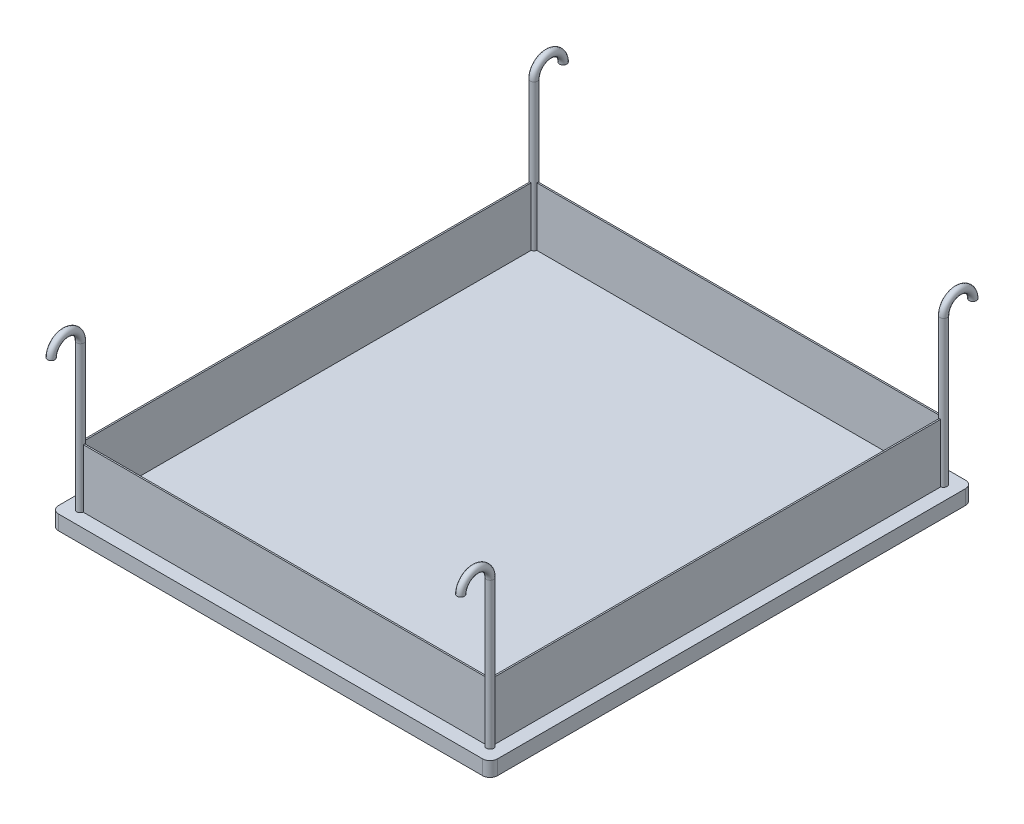
ISO-10303-21;
HEADER;
FILE_DESCRIPTION(('STEP AP214'),'2;1');
FILE_NAME('part.step','',(''),(''),'','','');
FILE_SCHEMA(('AUTOMOTIVE_DESIGN { 1 0 10303 214 1 1 1 1 }'));
ENDSEC;
DATA;
#1=APPLICATION_CONTEXT('core data for automotive mechanical design processes');
#2=APPLICATION_PROTOCOL_DEFINITION('international standard','automotive_design',2000,#1);
#3=PRODUCT_CONTEXT('',#1,'mechanical');
#4=PRODUCT('Part','Part','',(#3));
#5=PRODUCT_RELATED_PRODUCT_CATEGORY('part','',(#4));
#6=PRODUCT_DEFINITION_FORMATION('','',#4);
#7=PRODUCT_DEFINITION_CONTEXT('part definition',#1,'design');
#8=PRODUCT_DEFINITION('design','',#6,#7);
#9=PRODUCT_DEFINITION_SHAPE('','',#8);
#10=(LENGTH_UNIT() NAMED_UNIT(*) SI_UNIT(.MILLI.,.METRE.));
#11=(NAMED_UNIT(*) PLANE_ANGLE_UNIT() SI_UNIT($,.RADIAN.));
#12=(NAMED_UNIT(*) SI_UNIT($,.STERADIAN.) SOLID_ANGLE_UNIT());
#13=UNCERTAINTY_MEASURE_WITH_UNIT(LENGTH_MEASURE(1.E-05),#10,'distance_accuracy_value','');
#14=(GEOMETRIC_REPRESENTATION_CONTEXT(3) GLOBAL_UNCERTAINTY_ASSIGNED_CONTEXT((#13)) GLOBAL_UNIT_ASSIGNED_CONTEXT((#10,
#11,#12)) REPRESENTATION_CONTEXT('',''));
#15=CARTESIAN_POINT('',(0.,0.,0.));
#16=DIRECTION('',(0.,0.,1.));
#17=DIRECTION('',(1.,0.,0.));
#18=AXIS2_PLACEMENT_3D('',#15,#16,#17);
#19=CARTESIAN_POINT('',(0.,10.,0.));
#20=DIRECTION('',(0.,1.,0.));
#21=DIRECTION('',(0.,0.,1.));
#22=AXIS2_PLACEMENT_3D('',#19,#20,#21);
#23=PLANE('',#22);
#24=CARTESIAN_POINT('',(-140.,10.,-155.));
#25=DIRECTION('',(0.,1.,0.));
#26=DIRECTION('',(0.,0.,1.));
#27=AXIS2_PLACEMENT_3D('',#24,#25,#26);
#28=CIRCLE('',#27,2.5);
#29=CARTESIAN_POINT('',(-139.5,10.,-152.550510257217));
#30=VERTEX_POINT('',#29);
#31=CARTESIAN_POINT('',(-137.550510257217,10.,-154.5));
#32=VERTEX_POINT('',#31);
#33=EDGE_CURVE('E234',#30,#32,#28,.T.);
#34=ORIENTED_EDGE('',*,*,#33,.F.);
#35=DIRECTION('',(0.,0.,-1.));
#36=VECTOR('',#35,1.);
#37=CARTESIAN_POINT('',(-139.5,10.,0.));
#38=LINE('',#37,#36);
#39=CARTESIAN_POINT('',(-139.5,10.,152.550510257217));
#40=VERTEX_POINT('',#39);
#41=EDGE_CURVE('E273',#30,#40,#38,.F.);
#42=ORIENTED_EDGE('',*,*,#41,.T.);
#43=CARTESIAN_POINT('',(-140.,10.,155.));
#44=DIRECTION('',(0.,1.,0.));
#45=DIRECTION('',(0.,0.,1.));
#46=AXIS2_PLACEMENT_3D('',#43,#44,#45);
#47=CIRCLE('',#46,2.5);
#48=CARTESIAN_POINT('',(-137.550510257217,10.,154.5));
#49=VERTEX_POINT('',#48);
#50=EDGE_CURVE('E322',#49,#40,#47,.T.);
#51=ORIENTED_EDGE('',*,*,#50,.F.);
#52=DIRECTION('',(1.,0.,0.));
#53=VECTOR('',#52,1.);
#54=CARTESIAN_POINT('',(-140.,10.,154.5));
#55=LINE('',#54,#53);
#56=CARTESIAN_POINT('',(137.550510257217,10.,154.5));
#57=VERTEX_POINT('',#56);
#58=EDGE_CURVE('E370',#49,#57,#55,.T.);
#59=ORIENTED_EDGE('',*,*,#58,.T.);
#60=CARTESIAN_POINT('',(140.,10.,155.));
#61=DIRECTION('',(0.,1.,0.));
#62=DIRECTION('',(0.,0.,1.));
#63=AXIS2_PLACEMENT_3D('',#60,#61,#62);
#64=CIRCLE('',#63,2.5);
#65=CARTESIAN_POINT('',(139.5,10.,152.550510257217));
#66=VERTEX_POINT('',#65);
#67=EDGE_CURVE('E319',#66,#57,#64,.T.);
#68=ORIENTED_EDGE('',*,*,#67,.F.);
#69=DIRECTION('',(0.,0.,-1.));
#70=VECTOR('',#69,1.);
#71=CARTESIAN_POINT('',(139.5,10.,155.));
#72=LINE('',#71,#70);
#73=CARTESIAN_POINT('',(139.5,10.,-152.550510257217));
#74=VERTEX_POINT('',#73);
#75=EDGE_CURVE('E207',#66,#74,#72,.T.);
#76=ORIENTED_EDGE('',*,*,#75,.T.);
#77=CARTESIAN_POINT('',(140.,10.,-155.));
#78=DIRECTION('',(0.,1.,0.));
#79=DIRECTION('',(0.,0.,1.));
#80=AXIS2_PLACEMENT_3D('',#77,#78,#79);
#81=CIRCLE('',#80,2.5);
#82=CARTESIAN_POINT('',(137.550510257217,10.,-154.5));
#83=VERTEX_POINT('',#82);
#84=EDGE_CURVE('E228',#83,#74,#81,.T.);
#85=ORIENTED_EDGE('',*,*,#84,.F.);
#86=DIRECTION('',(1.,0.,0.));
#87=VECTOR('',#86,1.);
#88=CARTESIAN_POINT('',(-140.,10.,-154.5));
#89=LINE('',#88,#87);
#90=EDGE_CURVE('E276',#32,#83,#89,.T.);
#91=ORIENTED_EDGE('',*,*,#90,.F.);
#92=EDGE_LOOP('',(#34,#42,#51,#59,#68,#76,#85,#91));
#93=FACE_BOUND('',#92,.T.);
#94=ADVANCED_FACE('F33',(#93),#23,.T.);
#95=CARTESIAN_POINT('',(140.,10.,155.));
#96=DIRECTION('',(0.,1.,0.));
#97=DIRECTION('',(0.,0.,1.));
#98=AXIS2_PLACEMENT_3D('',#95,#96,#97);
#99=CYLINDRICAL_SURFACE('',#98,2.5);
#100=DIRECTION('',(0.,1.,0.));
#101=VECTOR('',#100,1.);
#102=CARTESIAN_POINT('',(137.550510257217,10.,154.5));
#103=LINE('',#102,#101);
#104=CARTESIAN_POINT('',(137.550510257217,50.,154.5));
#105=VERTEX_POINT('',#104);
#106=EDGE_CURVE('E284',#105,#57,#103,.F.);
#107=ORIENTED_EDGE('',*,*,#106,.F.);
#108=CARTESIAN_POINT('',(140.,50.,155.));
#109=DIRECTION('',(0.,-1.,0.));
#110=DIRECTION('',(0.,0.,-1.));
#111=AXIS2_PLACEMENT_3D('',#108,#109,#110);
#112=CIRCLE('',#111,2.5);
#113=CARTESIAN_POINT('',(137.550510257217,50.,155.5));
#114=VERTEX_POINT('',#113);
#115=EDGE_CURVE('E291',#105,#114,#112,.F.);
#116=ORIENTED_EDGE('',*,*,#115,.T.);
#117=DIRECTION('',(0.,1.,0.));
#118=VECTOR('',#117,1.);
#119=CARTESIAN_POINT('',(137.550510257217,10.,155.5));
#120=LINE('',#119,#118);
#121=CARTESIAN_POINT('',(137.550510257217,10.,155.5));
#122=VERTEX_POINT('',#121);
#123=EDGE_CURVE('E288',#114,#122,#120,.F.);
#124=ORIENTED_EDGE('',*,*,#123,.T.);
#125=CARTESIAN_POINT('',(140.5,10.,152.550510257217));
#126=VERTEX_POINT('',#125);
#127=EDGE_CURVE('E320',#122,#126,#64,.T.);
#128=ORIENTED_EDGE('',*,*,#127,.T.);
#129=DIRECTION('',(0.,1.,0.));
#130=VECTOR('',#129,1.);
#131=CARTESIAN_POINT('',(140.5,10.,152.550510257217));
#132=LINE('',#131,#130);
#133=CARTESIAN_POINT('',(140.5,50.,152.550510257217));
#134=VERTEX_POINT('',#133);
#135=EDGE_CURVE('E202',#126,#134,#132,.T.);
#136=ORIENTED_EDGE('',*,*,#135,.T.);
#137=CARTESIAN_POINT('',(139.5,50.,152.550510257217));
#138=VERTEX_POINT('',#137);
#139=EDGE_CURVE('E296',#134,#138,#112,.F.);
#140=ORIENTED_EDGE('',*,*,#139,.T.);
#141=DIRECTION('',(0.,1.,0.));
#142=VECTOR('',#141,1.);
#143=CARTESIAN_POINT('',(139.5,10.,152.550510257217));
#144=LINE('',#143,#142);
#145=EDGE_CURVE('E293',#66,#138,#144,.T.);
#146=ORIENTED_EDGE('',*,*,#145,.F.);
#147=ORIENTED_EDGE('',*,*,#67,.T.);
#148=EDGE_LOOP('',(#107,#116,#124,#128,#136,#140,#146,#147));
#149=FACE_BOUND('',#148,.T.);
#150=CARTESIAN_POINT('',(140.,110.,155.));
#151=DIRECTION('',(0.,1.,0.));
#152=DIRECTION('',(0.,0.,1.));
#153=AXIS2_PLACEMENT_3D('',#150,#151,#152);
#154=CIRCLE('',#153,2.5);
#155=CARTESIAN_POINT('',(140.,110.,152.5));
#156=VERTEX_POINT('',#155);
#157=EDGE_CURVE('E351',#156,#156,#154,.T.);
#158=ORIENTED_EDGE('',*,*,#157,.F.);
#159=EDGE_LOOP('',(#158));
#160=FACE_BOUND('',#159,.T.);
#161=ADVANCED_FACE('F430',(#149,#160),#99,.T.);
#162=CARTESIAN_POINT('',(-150.,10.,0.));
#163=DIRECTION('',(1.,0.,0.));
#164=DIRECTION('',(0.,0.,-1.));
#165=AXIS2_PLACEMENT_3D('',#162,#163,#164);
#166=PLANE('',#165);
#167=DIRECTION('',(0.,0.,1.));
#168=VECTOR('',#167,1.);
#169=CARTESIAN_POINT('',(-150.,10.,0.));
#170=LINE('',#169,#168);
#171=CARTESIAN_POINT('',(-150.,10.,-160.));
#172=VERTEX_POINT('',#171);
#173=CARTESIAN_POINT('',(-150.,10.,160.));
#174=VERTEX_POINT('',#173);
#175=EDGE_CURVE('E330',#172,#174,#170,.T.);
#176=ORIENTED_EDGE('',*,*,#175,.F.);
#177=DIRECTION('',(0.,-1.,0.));
#178=VECTOR('',#177,1.);
#179=CARTESIAN_POINT('',(-150.,0.,-160.));
#180=LINE('',#179,#178);
#181=CARTESIAN_POINT('',(-150.,0.,-160.));
#182=VERTEX_POINT('',#181);
#183=EDGE_CURVE('E227',#172,#182,#180,.T.);
#184=ORIENTED_EDGE('',*,*,#183,.T.);
#185=DIRECTION('',(0.,0.,1.));
#186=VECTOR('',#185,1.);
#187=CARTESIAN_POINT('',(-150.,0.,0.));
#188=LINE('',#187,#186);
#189=CARTESIAN_POINT('',(-150.,0.,160.));
#190=VERTEX_POINT('',#189);
#191=EDGE_CURVE('E334',#182,#190,#188,.T.);
#192=ORIENTED_EDGE('',*,*,#191,.T.);
#193=DIRECTION('',(0.,-1.,0.));
#194=VECTOR('',#193,1.);
#195=CARTESIAN_POINT('',(-150.,10.,160.));
#196=LINE('',#195,#194);
#197=EDGE_CURVE('E306',#190,#174,#196,.F.);
#198=ORIENTED_EDGE('',*,*,#197,.T.);
#199=EDGE_LOOP('',(#176,#184,#192,#198));
#200=FACE_BOUND('',#199,.T.);
#201=ADVANCED_FACE('F435',(#200),#166,.F.);
#202=CARTESIAN_POINT('',(-150.,10.,165.));
#203=DIRECTION('',(0.,0.,-1.));
#204=DIRECTION('',(-1.,0.,0.));
#205=AXIS2_PLACEMENT_3D('',#202,#203,#204);
#206=PLANE('',#205);
#207=DIRECTION('',(1.,0.,0.));
#208=VECTOR('',#207,1.);
#209=CARTESIAN_POINT('',(-150.,10.,165.));
#210=LINE('',#209,#208);
#211=CARTESIAN_POINT('',(-145.,10.,165.));
#212=VERTEX_POINT('',#211);
#213=CARTESIAN_POINT('',(145.,10.,165.));
#214=VERTEX_POINT('',#213);
#215=EDGE_CURVE('E339',#212,#214,#210,.T.);
#216=ORIENTED_EDGE('',*,*,#215,.F.);
#217=DIRECTION('',(0.,-1.,0.));
#218=VECTOR('',#217,1.);
#219=CARTESIAN_POINT('',(-145.,10.,165.));
#220=LINE('',#219,#218);
#221=CARTESIAN_POINT('',(-145.,0.,165.));
#222=VERTEX_POINT('',#221);
#223=EDGE_CURVE('E314',#212,#222,#220,.T.);
#224=ORIENTED_EDGE('',*,*,#223,.T.);
#225=DIRECTION('',(1.,0.,0.));
#226=VECTOR('',#225,1.);
#227=CARTESIAN_POINT('',(-150.,0.,165.));
#228=LINE('',#227,#226);
#229=CARTESIAN_POINT('',(145.,0.,165.));
#230=VERTEX_POINT('',#229);
#231=EDGE_CURVE('E331',#222,#230,#228,.T.);
#232=ORIENTED_EDGE('',*,*,#231,.T.);
#233=DIRECTION('',(0.,-1.,0.));
#234=VECTOR('',#233,1.);
#235=CARTESIAN_POINT('',(145.,10.,165.));
#236=LINE('',#235,#234);
#237=EDGE_CURVE('E317',#230,#214,#236,.F.);
#238=ORIENTED_EDGE('',*,*,#237,.T.);
#239=EDGE_LOOP('',(#216,#224,#232,#238));
#240=FACE_BOUND('',#239,.T.);
#241=ADVANCED_FACE('F450',(#240),#206,.F.);
#242=CARTESIAN_POINT('',(150.,10.,0.));
#243=DIRECTION('',(-1.,0.,0.));
#244=DIRECTION('',(0.,0.,1.));
#245=AXIS2_PLACEMENT_3D('',#242,#243,#244);
#246=PLANE('',#245);
#247=DIRECTION('',(0.,0.,-1.));
#248=VECTOR('',#247,1.);
#249=CARTESIAN_POINT('',(150.,0.,0.));
#250=LINE('',#249,#248);
#251=CARTESIAN_POINT('',(150.,0.,160.));
#252=VERTEX_POINT('',#251);
#253=CARTESIAN_POINT('',(150.,0.,-160.));
#254=VERTEX_POINT('',#253);
#255=EDGE_CURVE('E327',#252,#254,#250,.T.);
#256=ORIENTED_EDGE('',*,*,#255,.T.);
#257=DIRECTION('',(0.,-1.,0.));
#258=VECTOR('',#257,1.);
#259=CARTESIAN_POINT('',(150.,10.,-160.));
#260=LINE('',#259,#258);
#261=CARTESIAN_POINT('',(150.,10.,-160.));
#262=VERTEX_POINT('',#261);
#263=EDGE_CURVE('E250',#254,#262,#260,.F.);
#264=ORIENTED_EDGE('',*,*,#263,.T.);
#265=DIRECTION('',(0.,0.,-1.));
#266=VECTOR('',#265,1.);
#267=CARTESIAN_POINT('',(150.,10.,0.));
#268=LINE('',#267,#266);
#269=CARTESIAN_POINT('',(150.,10.,160.));
#270=VERTEX_POINT('',#269);
#271=EDGE_CURVE('E326',#270,#262,#268,.T.);
#272=ORIENTED_EDGE('',*,*,#271,.F.);
#273=DIRECTION('',(0.,-1.,0.));
#274=VECTOR('',#273,1.);
#275=CARTESIAN_POINT('',(150.,10.,160.));
#276=LINE('',#275,#274);
#277=EDGE_CURVE('E299',#270,#252,#276,.T.);
#278=ORIENTED_EDGE('',*,*,#277,.T.);
#279=EDGE_LOOP('',(#256,#264,#272,#278));
#280=FACE_BOUND('',#279,.T.);
#281=ADVANCED_FACE('F442',(#280),#246,.F.);
#282=CARTESIAN_POINT('',(140.5,10.,-152.550510257217));
#283=VERTEX_POINT('',#282);
#284=CARTESIAN_POINT('',(137.550510257217,10.,-155.5));
#285=VERTEX_POINT('',#284);
#286=EDGE_CURVE('E215',#283,#285,#81,.T.);
#287=ORIENTED_EDGE('',*,*,#286,.F.);
#288=DIRECTION('',(0.,0.,-1.));
#289=VECTOR('',#288,1.);
#290=CARTESIAN_POINT('',(140.5,10.,155.));
#291=LINE('',#290,#289);
#292=EDGE_CURVE('E195',#126,#283,#291,.T.);
#293=ORIENTED_EDGE('',*,*,#292,.F.);
#294=ORIENTED_EDGE('',*,*,#127,.F.);
#295=DIRECTION('',(1.,0.,0.));
#296=VECTOR('',#295,1.);
#297=CARTESIAN_POINT('',(-140.,10.,155.5));
#298=LINE('',#297,#296);
#299=CARTESIAN_POINT('',(-137.550510257217,10.,155.5));
#300=VERTEX_POINT('',#299);
#301=EDGE_CURVE('E364',#300,#122,#298,.T.);
#302=ORIENTED_EDGE('',*,*,#301,.F.);
#303=CARTESIAN_POINT('',(-140.5,10.,152.550510257217));
#304=VERTEX_POINT('',#303);
#305=EDGE_CURVE('E323',#304,#300,#47,.T.);
#306=ORIENTED_EDGE('',*,*,#305,.F.);
#307=DIRECTION('',(0.,0.,-1.));
#308=VECTOR('',#307,1.);
#309=CARTESIAN_POINT('',(-140.5,10.,0.));
#310=LINE('',#309,#308);
#311=CARTESIAN_POINT('',(-140.5,10.,-152.550510257217));
#312=VERTEX_POINT('',#311);
#313=EDGE_CURVE('E367',#312,#304,#310,.F.);
#314=ORIENTED_EDGE('',*,*,#313,.F.);
#315=CARTESIAN_POINT('',(-137.550510257217,10.,-155.5));
#316=VERTEX_POINT('',#315);
#317=EDGE_CURVE('E277',#316,#312,#28,.T.);
#318=ORIENTED_EDGE('',*,*,#317,.F.);
#319=DIRECTION('',(1.,0.,0.));
#320=VECTOR('',#319,1.);
#321=CARTESIAN_POINT('',(-140.,10.,-155.5));
#322=LINE('',#321,#320);
#323=EDGE_CURVE('E226',#316,#285,#322,.T.);
#324=ORIENTED_EDGE('',*,*,#323,.T.);
#325=EDGE_LOOP('',(#287,#293,#294,#302,#306,#314,#318,#324));
#326=FACE_BOUND('',#325,.T.);
#327=DIRECTION('',(1.,0.,0.));
#328=VECTOR('',#327,1.);
#329=CARTESIAN_POINT('',(-150.,10.,-165.));
#330=LINE('',#329,#328);
#331=CARTESIAN_POINT('',(-145.,10.,-165.));
#332=VERTEX_POINT('',#331);
#333=CARTESIAN_POINT('',(145.,10.,-165.));
#334=VERTEX_POINT('',#333);
#335=EDGE_CURVE('E208',#332,#334,#330,.T.);
#336=ORIENTED_EDGE('',*,*,#335,.F.);
#337=CARTESIAN_POINT('',(-145.,10.,-160.));
#338=DIRECTION('',(0.,1.,0.));
#339=DIRECTION('',(0.,0.,1.));
#340=AXIS2_PLACEMENT_3D('',#337,#338,#339);
#341=CIRCLE('',#340,5.);
#342=EDGE_CURVE('E248',#332,#172,#341,.T.);
#343=ORIENTED_EDGE('',*,*,#342,.T.);
#344=ORIENTED_EDGE('',*,*,#175,.T.);
#345=CARTESIAN_POINT('',(-145.,10.,160.));
#346=DIRECTION('',(0.,1.,0.));
#347=DIRECTION('',(0.,0.,1.));
#348=AXIS2_PLACEMENT_3D('',#345,#346,#347);
#349=CIRCLE('',#348,5.);
#350=EDGE_CURVE('E302',#174,#212,#349,.T.);
#351=ORIENTED_EDGE('',*,*,#350,.T.);
#352=ORIENTED_EDGE('',*,*,#215,.T.);
#353=CARTESIAN_POINT('',(145.,10.,160.));
#354=DIRECTION('',(0.,1.,0.));
#355=DIRECTION('',(0.,0.,1.));
#356=AXIS2_PLACEMENT_3D('',#353,#354,#355);
#357=CIRCLE('',#356,5.);
#358=EDGE_CURVE('E304',#214,#270,#357,.T.);
#359=ORIENTED_EDGE('',*,*,#358,.T.);
#360=ORIENTED_EDGE('',*,*,#271,.T.);
#361=CARTESIAN_POINT('',(145.,10.,-160.));
#362=DIRECTION('',(0.,1.,0.));
#363=DIRECTION('',(0.,0.,1.));
#364=AXIS2_PLACEMENT_3D('',#361,#362,#363);
#365=CIRCLE('',#364,5.);
#366=EDGE_CURVE('E246',#262,#334,#365,.T.);
#367=ORIENTED_EDGE('',*,*,#366,.T.);
#368=EDGE_LOOP('',(#336,#343,#344,#351,#352,#359,#360,#367));
#369=FACE_BOUND('',#368,.T.);
#370=ADVANCED_FACE('F223',(#326,#369),#23,.T.);
#371=CARTESIAN_POINT('',(0.,0.,0.));
#372=DIRECTION('',(0.,1.,0.));
#373=DIRECTION('',(0.,0.,1.));
#374=AXIS2_PLACEMENT_3D('',#371,#372,#373);
#375=PLANE('',#374);
#376=ORIENTED_EDGE('',*,*,#191,.F.);
#377=CARTESIAN_POINT('',(-145.,0.,-160.));
#378=DIRECTION('',(0.,1.,0.));
#379=DIRECTION('',(0.,0.,1.));
#380=AXIS2_PLACEMENT_3D('',#377,#378,#379);
#381=CIRCLE('',#380,5.);
#382=CARTESIAN_POINT('',(-145.,0.,-165.));
#383=VERTEX_POINT('',#382);
#384=EDGE_CURVE('E239',#182,#383,#381,.F.);
#385=ORIENTED_EDGE('',*,*,#384,.T.);
#386=DIRECTION('',(1.,0.,0.));
#387=VECTOR('',#386,1.);
#388=CARTESIAN_POINT('',(-150.,0.,-165.));
#389=LINE('',#388,#387);
#390=CARTESIAN_POINT('',(145.,0.,-165.));
#391=VERTEX_POINT('',#390);
#392=EDGE_CURVE('E384',#383,#391,#389,.T.);
#393=ORIENTED_EDGE('',*,*,#392,.T.);
#394=CARTESIAN_POINT('',(145.,0.,-160.));
#395=DIRECTION('',(0.,1.,0.));
#396=DIRECTION('',(0.,0.,1.));
#397=AXIS2_PLACEMENT_3D('',#394,#395,#396);
#398=CIRCLE('',#397,5.);
#399=EDGE_CURVE('E231',#391,#254,#398,.F.);
#400=ORIENTED_EDGE('',*,*,#399,.T.);
#401=ORIENTED_EDGE('',*,*,#255,.F.);
#402=CARTESIAN_POINT('',(145.,0.,160.));
#403=DIRECTION('',(0.,1.,0.));
#404=DIRECTION('',(0.,0.,1.));
#405=AXIS2_PLACEMENT_3D('',#402,#403,#404);
#406=CIRCLE('',#405,5.);
#407=EDGE_CURVE('E312',#252,#230,#406,.F.);
#408=ORIENTED_EDGE('',*,*,#407,.T.);
#409=ORIENTED_EDGE('',*,*,#231,.F.);
#410=CARTESIAN_POINT('',(-145.,0.,160.));
#411=DIRECTION('',(0.,1.,0.));
#412=DIRECTION('',(0.,0.,1.));
#413=AXIS2_PLACEMENT_3D('',#410,#411,#412);
#414=CIRCLE('',#413,5.);
#415=EDGE_CURVE('E309',#222,#190,#414,.F.);
#416=ORIENTED_EDGE('',*,*,#415,.T.);
#417=EDGE_LOOP('',(#376,#385,#393,#400,#401,#408,#409,#416));
#418=FACE_BOUND('',#417,.T.);
#419=ADVANCED_FACE('F441',(#418),#375,.F.);
#420=CARTESIAN_POINT('',(-140.,110.,175.));
#421=DIRECTION('',(0.,-1.,0.));
#422=DIRECTION('',(0.,0.,-1.));
#423=AXIS2_PLACEMENT_3D('',#420,#421,#422);
#424=PLANE('',#423);
#425=CARTESIAN_POINT('',(-140.,110.,175.));
#426=DIRECTION('',(0.,-1.,0.));
#427=DIRECTION('',(0.,0.,-1.));
#428=AXIS2_PLACEMENT_3D('',#425,#426,#427);
#429=CIRCLE('',#428,2.5);
#430=CARTESIAN_POINT('',(-140.,110.,177.5));
#431=VERTEX_POINT('',#430);
#432=EDGE_CURVE('E336',#431,#431,#429,.T.);
#433=ORIENTED_EDGE('',*,*,#432,.T.);
#434=EDGE_LOOP('',(#433));
#435=FACE_BOUND('',#434,.T.);
#436=ADVANCED_FACE('F447',(#435),#424,.T.);
#437=CARTESIAN_POINT('',(-140.,10.,155.));
#438=DIRECTION('',(0.,1.,0.));
#439=DIRECTION('',(0.,0.,1.));
#440=AXIS2_PLACEMENT_3D('',#437,#438,#439);
#441=CYLINDRICAL_SURFACE('',#440,2.5);
#442=DIRECTION('',(0.,1.,0.));
#443=VECTOR('',#442,1.);
#444=CARTESIAN_POINT('',(-137.550510257217,10.,154.5));
#445=LINE('',#444,#443);
#446=CARTESIAN_POINT('',(-137.550510257217,50.,154.5));
#447=VERTEX_POINT('',#446);
#448=EDGE_CURVE('E354',#49,#447,#445,.T.);
#449=ORIENTED_EDGE('',*,*,#448,.F.);
#450=ORIENTED_EDGE('',*,*,#50,.T.);
#451=DIRECTION('',(0.,1.,0.));
#452=VECTOR('',#451,1.);
#453=CARTESIAN_POINT('',(-139.5,10.,152.550510257217));
#454=LINE('',#453,#452);
#455=CARTESIAN_POINT('',(-139.5,50.,152.550510257217));
#456=VERTEX_POINT('',#455);
#457=EDGE_CURVE('E279',#456,#40,#454,.F.);
#458=ORIENTED_EDGE('',*,*,#457,.F.);
#459=CARTESIAN_POINT('',(-140.,50.,155.));
#460=DIRECTION('',(0.,-1.,0.));
#461=DIRECTION('',(0.,0.,-1.));
#462=AXIS2_PLACEMENT_3D('',#459,#460,#461);
#463=CIRCLE('',#462,2.5);
#464=CARTESIAN_POINT('',(-140.5,50.,152.550510257217));
#465=VERTEX_POINT('',#464);
#466=EDGE_CURVE('E360',#456,#465,#463,.F.);
#467=ORIENTED_EDGE('',*,*,#466,.T.);
#468=DIRECTION('',(0.,1.,0.));
#469=VECTOR('',#468,1.);
#470=CARTESIAN_POINT('',(-140.5,10.,152.550510257217));
#471=LINE('',#470,#469);
#472=EDGE_CURVE('E281',#465,#304,#471,.F.);
#473=ORIENTED_EDGE('',*,*,#472,.T.);
#474=ORIENTED_EDGE('',*,*,#305,.T.);
#475=DIRECTION('',(0.,1.,0.));
#476=VECTOR('',#475,1.);
#477=CARTESIAN_POINT('',(-137.550510257217,10.,155.5));
#478=LINE('',#477,#476);
#479=CARTESIAN_POINT('',(-137.550510257217,50.,155.5));
#480=VERTEX_POINT('',#479);
#481=EDGE_CURVE('E356',#300,#480,#478,.T.);
#482=ORIENTED_EDGE('',*,*,#481,.T.);
#483=EDGE_CURVE('E359',#480,#447,#463,.F.);
#484=ORIENTED_EDGE('',*,*,#483,.T.);
#485=EDGE_LOOP('',(#449,#450,#458,#467,#473,#474,#482,#484));
#486=FACE_BOUND('',#485,.T.);
#487=CARTESIAN_POINT('',(-140.,110.,155.));
#488=DIRECTION('',(0.,1.,0.));
#489=DIRECTION('',(0.,0.,1.));
#490=AXIS2_PLACEMENT_3D('',#487,#488,#489);
#491=CIRCLE('',#490,2.5);
#492=CARTESIAN_POINT('',(-140.,110.,152.5));
#493=VERTEX_POINT('',#492);
#494=EDGE_CURVE('E345',#493,#493,#491,.T.);
#495=ORIENTED_EDGE('',*,*,#494,.F.);
#496=EDGE_LOOP('',(#495));
#497=FACE_BOUND('',#496,.T.);
#498=ADVANCED_FACE('F536',(#486,#497),#441,.T.);
#499=CARTESIAN_POINT('',(-140.,110.,165.));
#500=DIRECTION('',(1.,0.,0.));
#501=DIRECTION('',(0.,0.,-1.));
#502=AXIS2_PLACEMENT_3D('',#499,#500,#501);
#503=TOROIDAL_SURFACE('',#502,9.99999999999998,2.5);
#504=CARTESIAN_POINT('',(-140.,110.,165.));
#505=DIRECTION('',(1.,0.,0.));
#506=DIRECTION('',(0.,0.,-1.));
#507=AXIS2_PLACEMENT_3D('',#504,#505,#506);
#508=CIRCLE('',#507,12.5);
#509=EDGE_CURVE('',#493,#431,#508,.T.);
#510=ORIENTED_EDGE('',*,*,#494,.T.);
#511=ORIENTED_EDGE('',*,*,#432,.F.);
#512=ORIENTED_EDGE('',*,*,#509,.T.);
#513=ORIENTED_EDGE('',*,*,#509,.F.);
#514=EDGE_LOOP('',(#510,#512,#511,#513));
#515=FACE_BOUND('',#514,.T.);
#516=ADVANCED_FACE('F449',(#515),#503,.T.);
#517=CARTESIAN_POINT('',(140.,110.,175.));
#518=DIRECTION('',(0.,-1.,0.));
#519=DIRECTION('',(0.,0.,-1.));
#520=AXIS2_PLACEMENT_3D('',#517,#518,#519);
#521=PLANE('',#520);
#522=CARTESIAN_POINT('',(140.,110.,175.));
#523=DIRECTION('',(0.,-1.,0.));
#524=DIRECTION('',(0.,0.,-1.));
#525=AXIS2_PLACEMENT_3D('',#522,#523,#524);
#526=CIRCLE('',#525,2.5);
#527=CARTESIAN_POINT('',(140.,110.,177.5));
#528=VERTEX_POINT('',#527);
#529=EDGE_CURVE('E348',#528,#528,#526,.T.);
#530=ORIENTED_EDGE('',*,*,#529,.T.);
#531=EDGE_LOOP('',(#530));
#532=FACE_BOUND('',#531,.T.);
#533=ADVANCED_FACE('F468',(#532),#521,.T.);
#534=CARTESIAN_POINT('',(140.,110.,165.));
#535=DIRECTION('',(1.,0.,0.));
#536=DIRECTION('',(0.,0.,-1.));
#537=AXIS2_PLACEMENT_3D('',#534,#535,#536);
#538=TOROIDAL_SURFACE('',#537,10.,2.5);
#539=CARTESIAN_POINT('',(140.,110.,165.));
#540=DIRECTION('',(1.,0.,0.));
#541=DIRECTION('',(0.,0.,-1.));
#542=AXIS2_PLACEMENT_3D('',#539,#540,#541);
#543=CIRCLE('',#542,12.5);
#544=EDGE_CURVE('',#156,#528,#543,.T.);
#545=ORIENTED_EDGE('',*,*,#157,.T.);
#546=ORIENTED_EDGE('',*,*,#529,.F.);
#547=ORIENTED_EDGE('',*,*,#544,.T.);
#548=ORIENTED_EDGE('',*,*,#544,.F.);
#549=EDGE_LOOP('',(#545,#547,#546,#548));
#550=FACE_BOUND('',#549,.T.);
#551=ADVANCED_FACE('F466',(#550),#538,.T.);
#552=CARTESIAN_POINT('',(-145.,10.,160.));
#553=DIRECTION('',(0.,-1.,0.));
#554=DIRECTION('',(0.,0.,-1.));
#555=AXIS2_PLACEMENT_3D('',#552,#553,#554);
#556=CYLINDRICAL_SURFACE('',#555,5.);
#557=ORIENTED_EDGE('',*,*,#350,.F.);
#558=ORIENTED_EDGE('',*,*,#197,.F.);
#559=ORIENTED_EDGE('',*,*,#415,.F.);
#560=ORIENTED_EDGE('',*,*,#223,.F.);
#561=EDGE_LOOP('',(#557,#558,#559,#560));
#562=FACE_BOUND('',#561,.T.);
#563=ADVANCED_FACE('F462',(#562),#556,.T.);
#564=CARTESIAN_POINT('',(145.,10.,160.));
#565=DIRECTION('',(0.,-1.,0.));
#566=DIRECTION('',(0.,0.,-1.));
#567=AXIS2_PLACEMENT_3D('',#564,#565,#566);
#568=CYLINDRICAL_SURFACE('',#567,5.);
#569=ORIENTED_EDGE('',*,*,#358,.F.);
#570=ORIENTED_EDGE('',*,*,#237,.F.);
#571=ORIENTED_EDGE('',*,*,#407,.F.);
#572=ORIENTED_EDGE('',*,*,#277,.F.);
#573=EDGE_LOOP('',(#569,#570,#571,#572));
#574=FACE_BOUND('',#573,.T.);
#575=ADVANCED_FACE('F465',(#574),#568,.T.);
#576=CARTESIAN_POINT('',(0.,50.,0.));
#577=DIRECTION('',(0.,-1.,0.));
#578=DIRECTION('',(-1.,0.,0.));
#579=AXIS2_PLACEMENT_3D('',#576,#577,#578);
#580=PLANE('',#579);
#581=ORIENTED_EDGE('',*,*,#139,.F.);
#582=DIRECTION('',(0.,0.,-1.));
#583=VECTOR('',#582,1.);
#584=CARTESIAN_POINT('',(140.5,50.,155.));
#585=LINE('',#584,#583);
#586=CARTESIAN_POINT('',(140.5,50.,-152.550510257217));
#587=VERTEX_POINT('',#586);
#588=EDGE_CURVE('E366',#134,#587,#585,.T.);
#589=ORIENTED_EDGE('',*,*,#588,.T.);
#590=CARTESIAN_POINT('',(140.,50.,-155.));
#591=DIRECTION('',(0.,-1.,0.));
#592=DIRECTION('',(0.,0.,-1.));
#593=AXIS2_PLACEMENT_3D('',#590,#591,#592);
#594=CIRCLE('',#593,2.5);
#595=CARTESIAN_POINT('',(139.5,50.,-152.550510257217));
#596=VERTEX_POINT('',#595);
#597=EDGE_CURVE('E218',#596,#587,#594,.F.);
#598=ORIENTED_EDGE('',*,*,#597,.F.);
#599=DIRECTION('',(0.,0.,-1.));
#600=VECTOR('',#599,1.);
#601=CARTESIAN_POINT('',(139.5,50.,155.));
#602=LINE('',#601,#600);
#603=EDGE_CURVE('E381',#138,#596,#602,.T.);
#604=ORIENTED_EDGE('',*,*,#603,.F.);
#605=EDGE_LOOP('',(#581,#589,#598,#604));
#606=FACE_BOUND('',#605,.T.);
#607=ADVANCED_FACE('F470',(#606),#580,.F.);
#608=CARTESIAN_POINT('',(139.5,50.,155.));
#609=DIRECTION('',(-1.,0.,0.));
#610=DIRECTION('',(0.,0.,1.));
#611=AXIS2_PLACEMENT_3D('',#608,#609,#610);
#612=PLANE('',#611);
#613=ORIENTED_EDGE('',*,*,#75,.F.);
#614=ORIENTED_EDGE('',*,*,#145,.T.);
#615=ORIENTED_EDGE('',*,*,#603,.T.);
#616=DIRECTION('',(0.,1.,0.));
#617=VECTOR('',#616,1.);
#618=CARTESIAN_POINT('',(139.5,10.,-152.550510257217));
#619=LINE('',#618,#617);
#620=EDGE_CURVE('E220',#74,#596,#619,.T.);
#621=ORIENTED_EDGE('',*,*,#620,.F.);
#622=EDGE_LOOP('',(#613,#614,#615,#621));
#623=FACE_BOUND('',#622,.T.);
#624=ADVANCED_FACE('F507',(#623),#612,.T.);
#625=CARTESIAN_POINT('',(140.5,50.,155.));
#626=DIRECTION('',(-1.,0.,0.));
#627=DIRECTION('',(0.,0.,1.));
#628=AXIS2_PLACEMENT_3D('',#625,#626,#627);
#629=PLANE('',#628);
#630=ORIENTED_EDGE('',*,*,#135,.F.);
#631=ORIENTED_EDGE('',*,*,#292,.T.);
#632=DIRECTION('',(0.,1.,0.));
#633=VECTOR('',#632,1.);
#634=CARTESIAN_POINT('',(140.5,10.,-152.550510257217));
#635=LINE('',#634,#633);
#636=EDGE_CURVE('E199',#283,#587,#635,.T.);
#637=ORIENTED_EDGE('',*,*,#636,.T.);
#638=ORIENTED_EDGE('',*,*,#588,.F.);
#639=EDGE_LOOP('',(#630,#631,#637,#638));
#640=FACE_BOUND('',#639,.T.);
#641=ADVANCED_FACE('F197',(#640),#629,.F.);
#642=ORIENTED_EDGE('',*,*,#483,.F.);
#643=DIRECTION('',(1.,0.,0.));
#644=VECTOR('',#643,1.);
#645=CARTESIAN_POINT('',(-140.,50.,155.5));
#646=LINE('',#645,#644);
#647=EDGE_CURVE('E363',#480,#114,#646,.T.);
#648=ORIENTED_EDGE('',*,*,#647,.T.);
#649=ORIENTED_EDGE('',*,*,#115,.F.);
#650=DIRECTION('',(1.,0.,0.));
#651=VECTOR('',#650,1.);
#652=CARTESIAN_POINT('',(-140.,50.,154.5));
#653=LINE('',#652,#651);
#654=EDGE_CURVE('E378',#447,#105,#653,.T.);
#655=ORIENTED_EDGE('',*,*,#654,.F.);
#656=EDGE_LOOP('',(#642,#648,#649,#655));
#657=FACE_BOUND('',#656,.T.);
#658=ADVANCED_FACE('F509',(#657),#580,.F.);
#659=CARTESIAN_POINT('',(-140.,50.,155.5));
#660=DIRECTION('',(0.,0.,-1.));
#661=DIRECTION('',(-1.,0.,0.));
#662=AXIS2_PLACEMENT_3D('',#659,#660,#661);
#663=PLANE('',#662);
#664=ORIENTED_EDGE('',*,*,#481,.F.);
#665=ORIENTED_EDGE('',*,*,#301,.T.);
#666=ORIENTED_EDGE('',*,*,#123,.F.);
#667=ORIENTED_EDGE('',*,*,#647,.F.);
#668=EDGE_LOOP('',(#664,#665,#666,#667));
#669=FACE_BOUND('',#668,.T.);
#670=ADVANCED_FACE('F511',(#669),#663,.F.);
#671=CARTESIAN_POINT('',(-140.,50.,154.5));
#672=DIRECTION('',(0.,0.,-1.));
#673=DIRECTION('',(-1.,0.,0.));
#674=AXIS2_PLACEMENT_3D('',#671,#672,#673);
#675=PLANE('',#674);
#676=ORIENTED_EDGE('',*,*,#58,.F.);
#677=ORIENTED_EDGE('',*,*,#448,.T.);
#678=ORIENTED_EDGE('',*,*,#654,.T.);
#679=ORIENTED_EDGE('',*,*,#106,.T.);
#680=EDGE_LOOP('',(#676,#677,#678,#679));
#681=FACE_BOUND('',#680,.T.);
#682=ADVANCED_FACE('F514',(#681),#675,.T.);
#683=ORIENTED_EDGE('',*,*,#466,.F.);
#684=DIRECTION('',(0.,0.,-1.));
#685=VECTOR('',#684,1.);
#686=CARTESIAN_POINT('',(-139.5,50.,0.));
#687=LINE('',#686,#685);
#688=CARTESIAN_POINT('',(-139.5,50.,-152.550510257217));
#689=VERTEX_POINT('',#688);
#690=EDGE_CURVE('E48',#689,#456,#687,.F.);
#691=ORIENTED_EDGE('',*,*,#690,.F.);
#692=CARTESIAN_POINT('',(-140.,50.,-155.));
#693=DIRECTION('',(0.,-1.,0.));
#694=DIRECTION('',(0.,0.,-1.));
#695=AXIS2_PLACEMENT_3D('',#692,#693,#694);
#696=CIRCLE('',#695,2.5);
#697=CARTESIAN_POINT('',(-140.5,50.,-152.550510257217));
#698=VERTEX_POINT('',#697);
#699=EDGE_CURVE('E267',#698,#689,#696,.F.);
#700=ORIENTED_EDGE('',*,*,#699,.F.);
#701=DIRECTION('',(0.,0.,-1.));
#702=VECTOR('',#701,1.);
#703=CARTESIAN_POINT('',(-140.5,50.,0.));
#704=LINE('',#703,#702);
#705=EDGE_CURVE('E375',#698,#465,#704,.F.);
#706=ORIENTED_EDGE('',*,*,#705,.T.);
#707=EDGE_LOOP('',(#683,#691,#700,#706));
#708=FACE_BOUND('',#707,.T.);
#709=ADVANCED_FACE('F510',(#708),#580,.F.);
#710=CARTESIAN_POINT('',(-139.5,50.,0.));
#711=DIRECTION('',(1.,0.,0.));
#712=DIRECTION('',(0.,0.,-1.));
#713=AXIS2_PLACEMENT_3D('',#710,#711,#712);
#714=PLANE('',#713);
#715=ORIENTED_EDGE('',*,*,#690,.T.);
#716=ORIENTED_EDGE('',*,*,#457,.T.);
#717=ORIENTED_EDGE('',*,*,#41,.F.);
#718=DIRECTION('',(0.,1.,0.));
#719=VECTOR('',#718,1.);
#720=CARTESIAN_POINT('',(-139.5,10.,-152.550510257217));
#721=LINE('',#720,#719);
#722=EDGE_CURVE('E41',#689,#30,#721,.F.);
#723=ORIENTED_EDGE('',*,*,#722,.F.);
#724=EDGE_LOOP('',(#715,#716,#717,#723));
#725=FACE_BOUND('',#724,.T.);
#726=ADVANCED_FACE('F518',(#725),#714,.T.);
#727=CARTESIAN_POINT('',(-140.5,50.,0.));
#728=DIRECTION('',(1.,0.,0.));
#729=DIRECTION('',(0.,0.,-1.));
#730=AXIS2_PLACEMENT_3D('',#727,#728,#729);
#731=PLANE('',#730);
#732=ORIENTED_EDGE('',*,*,#472,.F.);
#733=ORIENTED_EDGE('',*,*,#705,.F.);
#734=DIRECTION('',(0.,1.,0.));
#735=VECTOR('',#734,1.);
#736=CARTESIAN_POINT('',(-140.5,10.,-152.550510257217));
#737=LINE('',#736,#735);
#738=EDGE_CURVE('E11',#698,#312,#737,.F.);
#739=ORIENTED_EDGE('',*,*,#738,.T.);
#740=ORIENTED_EDGE('',*,*,#313,.T.);
#741=EDGE_LOOP('',(#732,#733,#739,#740));
#742=FACE_BOUND('',#741,.T.);
#743=ADVANCED_FACE('F503',(#742),#731,.F.);
#744=CARTESIAN_POINT('',(-150.,10.,-165.));
#745=DIRECTION('',(0.,0.,-1.));
#746=DIRECTION('',(-1.,0.,0.));
#747=AXIS2_PLACEMENT_3D('',#744,#745,#746);
#748=PLANE('',#747);
#749=ORIENTED_EDGE('',*,*,#392,.F.);
#750=DIRECTION('',(0.,-1.,0.));
#751=VECTOR('',#750,1.);
#752=CARTESIAN_POINT('',(-145.,10.,-165.));
#753=LINE('',#752,#751);
#754=EDGE_CURVE('E244',#383,#332,#753,.F.);
#755=ORIENTED_EDGE('',*,*,#754,.T.);
#756=ORIENTED_EDGE('',*,*,#335,.T.);
#757=DIRECTION('',(0.,-1.,0.));
#758=VECTOR('',#757,1.);
#759=CARTESIAN_POINT('',(145.,0.,-165.));
#760=LINE('',#759,#758);
#761=EDGE_CURVE('E241',#334,#391,#760,.T.);
#762=ORIENTED_EDGE('',*,*,#761,.T.);
#763=EDGE_LOOP('',(#749,#755,#756,#762));
#764=FACE_BOUND('',#763,.T.);
#765=ADVANCED_FACE('F494',(#764),#748,.T.);
#766=CARTESIAN_POINT('',(-140.,110.,-175.));
#767=DIRECTION('',(0.,-1.,0.));
#768=DIRECTION('',(0.,0.,1.));
#769=AXIS2_PLACEMENT_3D('',#766,#767,#768);
#770=PLANE('',#769);
#771=CARTESIAN_POINT('',(-140.,110.,-175.));
#772=DIRECTION('',(0.,1.,0.));
#773=DIRECTION('',(0.,0.,1.));
#774=AXIS2_PLACEMENT_3D('',#771,#772,#773);
#775=CIRCLE('',#774,2.5);
#776=CARTESIAN_POINT('',(-140.,110.,-177.5));
#777=VERTEX_POINT('',#776);
#778=EDGE_CURVE('E387',#777,#777,#775,.F.);
#779=ORIENTED_EDGE('',*,*,#778,.T.);
#780=EDGE_LOOP('',(#779));
#781=FACE_BOUND('',#780,.T.);
#782=ADVANCED_FACE('F481',(#781),#770,.T.);
#783=CARTESIAN_POINT('',(-140.,10.,-155.));
#784=DIRECTION('',(0.,1.,0.));
#785=DIRECTION('',(0.,0.,1.));
#786=AXIS2_PLACEMENT_3D('',#783,#784,#785);
#787=CYLINDRICAL_SURFACE('',#786,2.5);
#788=ORIENTED_EDGE('',*,*,#738,.F.);
#789=ORIENTED_EDGE('',*,*,#699,.T.);
#790=ORIENTED_EDGE('',*,*,#722,.T.);
#791=ORIENTED_EDGE('',*,*,#33,.T.);
#792=DIRECTION('',(0.,1.,0.));
#793=VECTOR('',#792,1.);
#794=CARTESIAN_POINT('',(-137.550510257217,10.,-154.5));
#795=LINE('',#794,#793);
#796=CARTESIAN_POINT('',(-137.550510257217,50.,-154.5));
#797=VERTEX_POINT('',#796);
#798=EDGE_CURVE('E403',#32,#797,#795,.T.);
#799=ORIENTED_EDGE('',*,*,#798,.T.);
#800=CARTESIAN_POINT('',(-137.550510257217,50.,-155.5));
#801=VERTEX_POINT('',#800);
#802=EDGE_CURVE('E405',#797,#801,#696,.F.);
#803=ORIENTED_EDGE('',*,*,#802,.T.);
#804=DIRECTION('',(0.,1.,0.));
#805=VECTOR('',#804,1.);
#806=CARTESIAN_POINT('',(-137.550510257217,10.,-155.5));
#807=LINE('',#806,#805);
#808=EDGE_CURVE('E401',#316,#801,#807,.T.);
#809=ORIENTED_EDGE('',*,*,#808,.F.);
#810=ORIENTED_EDGE('',*,*,#317,.T.);
#811=EDGE_LOOP('',(#788,#789,#790,#791,#799,#803,#809,#810));
#812=FACE_BOUND('',#811,.T.);
#813=CARTESIAN_POINT('',(-140.,110.,-155.));
#814=DIRECTION('',(0.,-1.,0.));
#815=DIRECTION('',(0.,0.,-1.));
#816=AXIS2_PLACEMENT_3D('',#813,#814,#815);
#817=CIRCLE('',#816,2.5);
#818=CARTESIAN_POINT('',(-140.,110.,-152.5));
#819=VERTEX_POINT('',#818);
#820=EDGE_CURVE('E392',#819,#819,#817,.F.);
#821=ORIENTED_EDGE('',*,*,#820,.F.);
#822=EDGE_LOOP('',(#821));
#823=FACE_BOUND('',#822,.T.);
#824=ADVANCED_FACE('F264',(#812,#823),#787,.T.);
#825=CARTESIAN_POINT('',(-140.,110.,-165.));
#826=DIRECTION('',(-1.,0.,0.));
#827=DIRECTION('',(0.,0.,1.));
#828=AXIS2_PLACEMENT_3D('',#825,#826,#827);
#829=TOROIDAL_SURFACE('',#828,9.99999999999998,2.5);
#830=CARTESIAN_POINT('',(-140.,110.,-165.));
#831=DIRECTION('',(-1.,0.,0.));
#832=DIRECTION('',(0.,0.,1.));
#833=AXIS2_PLACEMENT_3D('',#830,#831,#832);
#834=CIRCLE('',#833,12.5);
#835=EDGE_CURVE('',#819,#777,#834,.T.);
#836=ORIENTED_EDGE('',*,*,#820,.T.);
#837=ORIENTED_EDGE('',*,*,#778,.F.);
#838=ORIENTED_EDGE('',*,*,#835,.T.);
#839=ORIENTED_EDGE('',*,*,#835,.F.);
#840=EDGE_LOOP('',(#836,#838,#837,#839));
#841=FACE_BOUND('',#840,.T.);
#842=ADVANCED_FACE('F484',(#841),#829,.T.);
#843=CARTESIAN_POINT('',(140.,110.,-175.));
#844=DIRECTION('',(0.,-1.,0.));
#845=DIRECTION('',(0.,0.,1.));
#846=AXIS2_PLACEMENT_3D('',#843,#844,#845);
#847=PLANE('',#846);
#848=CARTESIAN_POINT('',(140.,110.,-175.));
#849=DIRECTION('',(0.,1.,0.));
#850=DIRECTION('',(0.,0.,1.));
#851=AXIS2_PLACEMENT_3D('',#848,#849,#850);
#852=CIRCLE('',#851,2.5);
#853=CARTESIAN_POINT('',(140.,110.,-177.5));
#854=VERTEX_POINT('',#853);
#855=EDGE_CURVE('E395',#854,#854,#852,.F.);
#856=ORIENTED_EDGE('',*,*,#855,.T.);
#857=EDGE_LOOP('',(#856));
#858=FACE_BOUND('',#857,.T.);
#859=ADVANCED_FACE('F475',(#858),#847,.T.);
#860=CARTESIAN_POINT('',(140.,10.,-155.));
#861=DIRECTION('',(0.,1.,0.));
#862=DIRECTION('',(0.,0.,1.));
#863=AXIS2_PLACEMENT_3D('',#860,#861,#862);
#864=CYLINDRICAL_SURFACE('',#863,2.5);
#865=DIRECTION('',(0.,1.,0.));
#866=VECTOR('',#865,1.);
#867=CARTESIAN_POINT('',(137.550510257217,10.,-155.5));
#868=LINE('',#867,#866);
#869=CARTESIAN_POINT('',(137.550510257217,50.,-155.5));
#870=VERTEX_POINT('',#869);
#871=EDGE_CURVE('E257',#870,#285,#868,.F.);
#872=ORIENTED_EDGE('',*,*,#871,.F.);
#873=CARTESIAN_POINT('',(137.550510257217,50.,-154.5));
#874=VERTEX_POINT('',#873);
#875=EDGE_CURVE('E219',#870,#874,#594,.F.);
#876=ORIENTED_EDGE('',*,*,#875,.T.);
#877=DIRECTION('',(0.,1.,0.));
#878=VECTOR('',#877,1.);
#879=CARTESIAN_POINT('',(137.550510257217,10.,-154.5));
#880=LINE('',#879,#878);
#881=EDGE_CURVE('E254',#874,#83,#880,.F.);
#882=ORIENTED_EDGE('',*,*,#881,.T.);
#883=ORIENTED_EDGE('',*,*,#84,.T.);
#884=ORIENTED_EDGE('',*,*,#620,.T.);
#885=ORIENTED_EDGE('',*,*,#597,.T.);
#886=ORIENTED_EDGE('',*,*,#636,.F.);
#887=ORIENTED_EDGE('',*,*,#286,.T.);
#888=EDGE_LOOP('',(#872,#876,#882,#883,#884,#885,#886,#887));
#889=FACE_BOUND('',#888,.T.);
#890=CARTESIAN_POINT('',(140.,110.,-155.));
#891=DIRECTION('',(0.,-1.,0.));
#892=DIRECTION('',(0.,0.,-1.));
#893=AXIS2_PLACEMENT_3D('',#890,#891,#892);
#894=CIRCLE('',#893,2.5);
#895=CARTESIAN_POINT('',(140.,110.,-152.5));
#896=VERTEX_POINT('',#895);
#897=EDGE_CURVE('E398',#896,#896,#894,.F.);
#898=ORIENTED_EDGE('',*,*,#897,.F.);
#899=EDGE_LOOP('',(#898));
#900=FACE_BOUND('',#899,.T.);
#901=ADVANCED_FACE('F213',(#889,#900),#864,.T.);
#902=CARTESIAN_POINT('',(140.,110.,-165.));
#903=DIRECTION('',(-1.,0.,0.));
#904=DIRECTION('',(0.,0.,1.));
#905=AXIS2_PLACEMENT_3D('',#902,#903,#904);
#906=TOROIDAL_SURFACE('',#905,10.,2.5);
#907=CARTESIAN_POINT('',(140.,110.,-165.));
#908=DIRECTION('',(-1.,0.,0.));
#909=DIRECTION('',(0.,0.,1.));
#910=AXIS2_PLACEMENT_3D('',#907,#908,#909);
#911=CIRCLE('',#910,12.5);
#912=EDGE_CURVE('',#896,#854,#911,.T.);
#913=ORIENTED_EDGE('',*,*,#897,.T.);
#914=ORIENTED_EDGE('',*,*,#855,.F.);
#915=ORIENTED_EDGE('',*,*,#912,.T.);
#916=ORIENTED_EDGE('',*,*,#912,.F.);
#917=EDGE_LOOP('',(#913,#915,#914,#916));
#918=FACE_BOUND('',#917,.T.);
#919=ADVANCED_FACE('F473',(#918),#906,.T.);
#920=CARTESIAN_POINT('',(-145.,10.,-160.));
#921=DIRECTION('',(0.,1.,0.));
#922=DIRECTION('',(0.,0.,1.));
#923=AXIS2_PLACEMENT_3D('',#920,#921,#922);
#924=CYLINDRICAL_SURFACE('',#923,5.);
#925=ORIENTED_EDGE('',*,*,#342,.F.);
#926=ORIENTED_EDGE('',*,*,#754,.F.);
#927=ORIENTED_EDGE('',*,*,#384,.F.);
#928=ORIENTED_EDGE('',*,*,#183,.F.);
#929=EDGE_LOOP('',(#925,#926,#927,#928));
#930=FACE_BOUND('',#929,.T.);
#931=ADVANCED_FACE('F427',(#930),#924,.T.);
#932=CARTESIAN_POINT('',(145.,10.,-160.));
#933=DIRECTION('',(0.,1.,0.));
#934=DIRECTION('',(0.,0.,1.));
#935=AXIS2_PLACEMENT_3D('',#932,#933,#934);
#936=CYLINDRICAL_SURFACE('',#935,5.);
#937=ORIENTED_EDGE('',*,*,#366,.F.);
#938=ORIENTED_EDGE('',*,*,#263,.F.);
#939=ORIENTED_EDGE('',*,*,#399,.F.);
#940=ORIENTED_EDGE('',*,*,#761,.F.);
#941=EDGE_LOOP('',(#937,#938,#939,#940));
#942=FACE_BOUND('',#941,.T.);
#943=ADVANCED_FACE('F35',(#942),#936,.T.);
#944=CARTESIAN_POINT('',(0.,50.,0.));
#945=DIRECTION('',(0.,-1.,0.));
#946=DIRECTION('',(-1.,0.,0.));
#947=AXIS2_PLACEMENT_3D('',#944,#945,#946);
#948=PLANE('',#947);
#949=ORIENTED_EDGE('',*,*,#802,.F.);
#950=DIRECTION('',(1.,0.,0.));
#951=VECTOR('',#950,1.);
#952=CARTESIAN_POINT('',(-140.,50.,-154.5));
#953=LINE('',#952,#951);
#954=EDGE_CURVE('E56',#797,#874,#953,.T.);
#955=ORIENTED_EDGE('',*,*,#954,.T.);
#956=ORIENTED_EDGE('',*,*,#875,.F.);
#957=DIRECTION('',(1.,0.,0.));
#958=VECTOR('',#957,1.);
#959=CARTESIAN_POINT('',(-140.,50.,-155.5));
#960=LINE('',#959,#958);
#961=EDGE_CURVE('E409',#801,#870,#960,.T.);
#962=ORIENTED_EDGE('',*,*,#961,.F.);
#963=EDGE_LOOP('',(#949,#955,#956,#962));
#964=FACE_BOUND('',#963,.T.);
#965=ADVANCED_FACE('F417',(#964),#948,.F.);
#966=CARTESIAN_POINT('',(-140.,50.,-154.5));
#967=DIRECTION('',(0.,0.,-1.));
#968=DIRECTION('',(-1.,0.,0.));
#969=AXIS2_PLACEMENT_3D('',#966,#967,#968);
#970=PLANE('',#969);
#971=ORIENTED_EDGE('',*,*,#798,.F.);
#972=ORIENTED_EDGE('',*,*,#90,.T.);
#973=ORIENTED_EDGE('',*,*,#881,.F.);
#974=ORIENTED_EDGE('',*,*,#954,.F.);
#975=EDGE_LOOP('',(#971,#972,#973,#974));
#976=FACE_BOUND('',#975,.T.);
#977=ADVANCED_FACE('F419',(#976),#970,.F.);
#978=CARTESIAN_POINT('',(-140.,50.,-155.5));
#979=DIRECTION('',(0.,0.,-1.));
#980=DIRECTION('',(-1.,0.,0.));
#981=AXIS2_PLACEMENT_3D('',#978,#979,#980);
#982=PLANE('',#981);
#983=ORIENTED_EDGE('',*,*,#323,.F.);
#984=ORIENTED_EDGE('',*,*,#808,.T.);
#985=ORIENTED_EDGE('',*,*,#961,.T.);
#986=ORIENTED_EDGE('',*,*,#871,.T.);
#987=EDGE_LOOP('',(#983,#984,#985,#986));
#988=FACE_BOUND('',#987,.T.);
#989=ADVANCED_FACE('F415',(#988),#982,.T.);
#990=CLOSED_SHELL('',(#94,#161,#201,#241,#281,#370,#419,#436,#498,#516,#533,#551,#563,#575,#607,
#624,#641,#658,#670,#682,#709,#726,#743,#765,#782,#824,#842,#859,#901,#919,#931,#943,#965,#977,#989));
#991=MANIFOLD_SOLID_BREP('B2',#990);
#992=ADVANCED_BREP_SHAPE_REPRESENTATION('',(#18,#991),#14);
#993=SHAPE_DEFINITION_REPRESENTATION(#9,#992);
ENDSEC;
END-ISO-10303-21;
